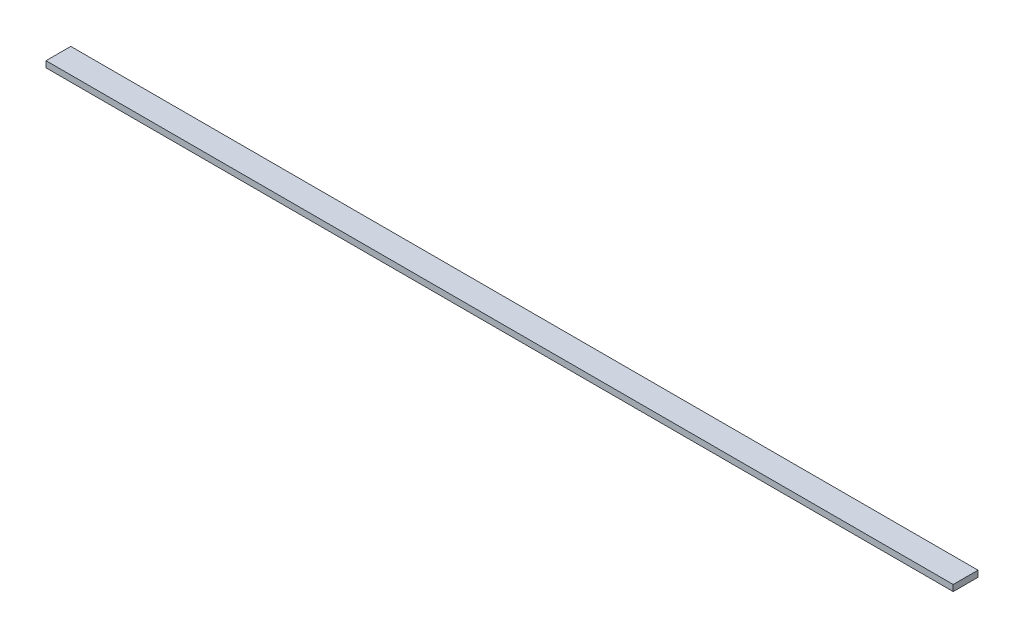
ISO-10303-21;
HEADER;
FILE_DESCRIPTION(('STEP AP214'),'2;1');
FILE_NAME('part.step','',(''),(''),'','','');
FILE_SCHEMA(('AUTOMOTIVE_DESIGN { 1 0 10303 214 1 1 1 1 }'));
ENDSEC;
DATA;
#1=APPLICATION_CONTEXT('core data for automotive mechanical design processes');
#2=APPLICATION_PROTOCOL_DEFINITION('international standard','automotive_design',2000,#1);
#3=PRODUCT_CONTEXT('',#1,'mechanical');
#4=PRODUCT('Part','Part','',(#3));
#5=PRODUCT_RELATED_PRODUCT_CATEGORY('part','',(#4));
#6=PRODUCT_DEFINITION_FORMATION('','',#4);
#7=PRODUCT_DEFINITION_CONTEXT('part definition',#1,'design');
#8=PRODUCT_DEFINITION('design','',#6,#7);
#9=PRODUCT_DEFINITION_SHAPE('','',#8);
#10=(LENGTH_UNIT() NAMED_UNIT(*) SI_UNIT(.MILLI.,.METRE.));
#11=(NAMED_UNIT(*) PLANE_ANGLE_UNIT() SI_UNIT($,.RADIAN.));
#12=(NAMED_UNIT(*) SI_UNIT($,.STERADIAN.) SOLID_ANGLE_UNIT());
#13=UNCERTAINTY_MEASURE_WITH_UNIT(LENGTH_MEASURE(1.E-05),#10,'distance_accuracy_value','');
#14=(GEOMETRIC_REPRESENTATION_CONTEXT(3) GLOBAL_UNCERTAINTY_ASSIGNED_CONTEXT((#13)) GLOBAL_UNIT_ASSIGNED_CONTEXT((#10,
#11,#12)) REPRESENTATION_CONTEXT('',''));
#15=CARTESIAN_POINT('',(0.,0.,0.));
#16=DIRECTION('',(0.,0.,1.));
#17=DIRECTION('',(1.,0.,0.));
#18=AXIS2_PLACEMENT_3D('',#15,#16,#17);
#19=CARTESIAN_POINT('',(0.,6.35,0.));
#20=DIRECTION('',(0.,-1.,0.));
#21=DIRECTION('',(0.,0.,-1.));
#22=AXIS2_PLACEMENT_3D('',#19,#20,#21);
#23=PLANE('',#22);
#24=DIRECTION('',(0.,0.,1.));
#25=VECTOR('',#24,1.);
#26=CARTESIAN_POINT('',(-465.,6.35,-277.5));
#27=LINE('',#26,#25);
#28=CARTESIAN_POINT('',(-465.,6.35,-277.5));
#29=VERTEX_POINT('',#28);
#30=CARTESIAN_POINT('',(-465.,6.35,-252.1));
#31=VERTEX_POINT('',#30);
#32=EDGE_CURVE('E99',#29,#31,#27,.T.);
#33=ORIENTED_EDGE('',*,*,#32,.T.);
#34=DIRECTION('',(-1.,0.,0.));
#35=VECTOR('',#34,1.);
#36=CARTESIAN_POINT('',(388.8,6.35,-252.1));
#37=LINE('',#36,#35);
#38=CARTESIAN_POINT('',(465.,6.35,-252.1));
#39=VERTEX_POINT('',#38);
#40=EDGE_CURVE('E70',#39,#31,#37,.T.);
#41=ORIENTED_EDGE('',*,*,#40,.F.);
#42=DIRECTION('',(0.,0.,-1.));
#43=VECTOR('',#42,1.);
#44=CARTESIAN_POINT('',(465.,6.35,-277.5));
#45=LINE('',#44,#43);
#46=CARTESIAN_POINT('',(465.,6.35,-277.5));
#47=VERTEX_POINT('',#46);
#48=EDGE_CURVE('E92',#39,#47,#45,.T.);
#49=ORIENTED_EDGE('',*,*,#48,.T.);
#50=DIRECTION('',(-1.,0.,0.));
#51=VECTOR('',#50,1.);
#52=CARTESIAN_POINT('',(465.,6.35,-277.5));
#53=LINE('',#52,#51);
#54=EDGE_CURVE('E54',#47,#29,#53,.T.);
#55=ORIENTED_EDGE('',*,*,#54,.T.);
#56=EDGE_LOOP('',(#33,#41,#49,#55));
#57=FACE_BOUND('',#56,.T.);
#58=ADVANCED_FACE('F37',(#57),#23,.F.);
#59=CARTESIAN_POINT('',(0.,0.,0.));
#60=DIRECTION('',(0.,-1.,0.));
#61=DIRECTION('',(0.,0.,-1.));
#62=AXIS2_PLACEMENT_3D('',#59,#60,#61);
#63=PLANE('',#62);
#64=DIRECTION('',(-1.,0.,0.));
#65=VECTOR('',#64,1.);
#66=CARTESIAN_POINT('',(388.8,0.,-252.1));
#67=LINE('',#66,#65);
#68=CARTESIAN_POINT('',(465.,0.,-252.1));
#69=VERTEX_POINT('',#68);
#70=CARTESIAN_POINT('',(-465.,0.,-252.1));
#71=VERTEX_POINT('',#70);
#72=EDGE_CURVE('E81',#69,#71,#67,.T.);
#73=ORIENTED_EDGE('',*,*,#72,.T.);
#74=DIRECTION('',(0.,0.,1.));
#75=VECTOR('',#74,1.);
#76=CARTESIAN_POINT('',(-465.,0.,-277.5));
#77=LINE('',#76,#75);
#78=CARTESIAN_POINT('',(-465.,0.,-277.5));
#79=VERTEX_POINT('',#78);
#80=EDGE_CURVE('E97',#79,#71,#77,.T.);
#81=ORIENTED_EDGE('',*,*,#80,.F.);
#82=DIRECTION('',(-1.,0.,0.));
#83=VECTOR('',#82,1.);
#84=CARTESIAN_POINT('',(465.,0.,-277.5));
#85=LINE('',#84,#83);
#86=CARTESIAN_POINT('',(465.,0.,-277.5));
#87=VERTEX_POINT('',#86);
#88=EDGE_CURVE('E96',#87,#79,#85,.T.);
#89=ORIENTED_EDGE('',*,*,#88,.F.);
#90=DIRECTION('',(0.,0.,-1.));
#91=VECTOR('',#90,1.);
#92=CARTESIAN_POINT('',(465.,0.,-277.5));
#93=LINE('',#92,#91);
#94=EDGE_CURVE('E65',#69,#87,#93,.T.);
#95=ORIENTED_EDGE('',*,*,#94,.F.);
#96=EDGE_LOOP('',(#73,#81,#89,#95));
#97=FACE_BOUND('',#96,.T.);
#98=ADVANCED_FACE('F95',(#97),#63,.T.);
#99=CARTESIAN_POINT('',(-465.,6.35,-277.5));
#100=DIRECTION('',(1.,0.,0.));
#101=DIRECTION('',(0.,0.,-1.));
#102=AXIS2_PLACEMENT_3D('',#99,#100,#101);
#103=PLANE('',#102);
#104=ORIENTED_EDGE('',*,*,#80,.T.);
#105=DIRECTION('',(0.,1.,0.));
#106=VECTOR('',#105,1.);
#107=CARTESIAN_POINT('',(-465.,0.,-252.1));
#108=LINE('',#107,#106);
#109=EDGE_CURVE('E86',#71,#31,#108,.T.);
#110=ORIENTED_EDGE('',*,*,#109,.T.);
#111=ORIENTED_EDGE('',*,*,#32,.F.);
#112=DIRECTION('',(0.,-1.,0.));
#113=VECTOR('',#112,1.);
#114=CARTESIAN_POINT('',(-465.,6.35,-277.5));
#115=LINE('',#114,#113);
#116=EDGE_CURVE('E46',#29,#79,#115,.T.);
#117=ORIENTED_EDGE('',*,*,#116,.T.);
#118=EDGE_LOOP('',(#104,#110,#111,#117));
#119=FACE_BOUND('',#118,.T.);
#120=ADVANCED_FACE('F39',(#119),#103,.F.);
#121=CARTESIAN_POINT('',(465.,6.35,-277.5));
#122=DIRECTION('',(-1.,0.,0.));
#123=DIRECTION('',(0.,0.,1.));
#124=AXIS2_PLACEMENT_3D('',#121,#122,#123);
#125=PLANE('',#124);
#126=ORIENTED_EDGE('',*,*,#48,.F.);
#127=DIRECTION('',(0.,1.,0.));
#128=VECTOR('',#127,1.);
#129=CARTESIAN_POINT('',(465.,0.,-252.1));
#130=LINE('',#129,#128);
#131=EDGE_CURVE('E83',#69,#39,#130,.T.);
#132=ORIENTED_EDGE('',*,*,#131,.F.);
#133=ORIENTED_EDGE('',*,*,#94,.T.);
#134=DIRECTION('',(0.,-1.,0.));
#135=VECTOR('',#134,1.);
#136=CARTESIAN_POINT('',(465.,6.35,-277.5));
#137=LINE('',#136,#135);
#138=EDGE_CURVE('E11',#47,#87,#137,.T.);
#139=ORIENTED_EDGE('',*,*,#138,.F.);
#140=EDGE_LOOP('',(#126,#132,#133,#139));
#141=FACE_BOUND('',#140,.T.);
#142=ADVANCED_FACE('F91',(#141),#125,.F.);
#143=CARTESIAN_POINT('',(465.,6.35,-277.5));
#144=DIRECTION('',(0.,0.,1.));
#145=DIRECTION('',(1.,0.,0.));
#146=AXIS2_PLACEMENT_3D('',#143,#144,#145);
#147=PLANE('',#146);
#148=ORIENTED_EDGE('',*,*,#88,.T.);
#149=ORIENTED_EDGE('',*,*,#116,.F.);
#150=ORIENTED_EDGE('',*,*,#54,.F.);
#151=ORIENTED_EDGE('',*,*,#138,.T.);
#152=EDGE_LOOP('',(#148,#149,#150,#151));
#153=FACE_BOUND('',#152,.T.);
#154=ADVANCED_FACE('F118',(#153),#147,.F.);
#155=CARTESIAN_POINT('',(388.8,6.35,-252.1));
#156=DIRECTION('',(0.,0.,1.));
#157=DIRECTION('',(1.,0.,0.));
#158=AXIS2_PLACEMENT_3D('',#155,#156,#157);
#159=PLANE('',#158);
#160=ORIENTED_EDGE('',*,*,#72,.F.);
#161=ORIENTED_EDGE('',*,*,#131,.T.);
#162=ORIENTED_EDGE('',*,*,#40,.T.);
#163=ORIENTED_EDGE('',*,*,#109,.F.);
#164=EDGE_LOOP('',(#160,#161,#162,#163));
#165=FACE_BOUND('',#164,.T.);
#166=ADVANCED_FACE('F82',(#165),#159,.T.);
#167=CLOSED_SHELL('',(#58,#98,#120,#142,#154,#166));
#168=MANIFOLD_SOLID_BREP('B2',#167);
#169=ADVANCED_BREP_SHAPE_REPRESENTATION('',(#18,#168),#14);
#170=SHAPE_DEFINITION_REPRESENTATION(#9,#169);
ENDSEC;
END-ISO-10303-21;
